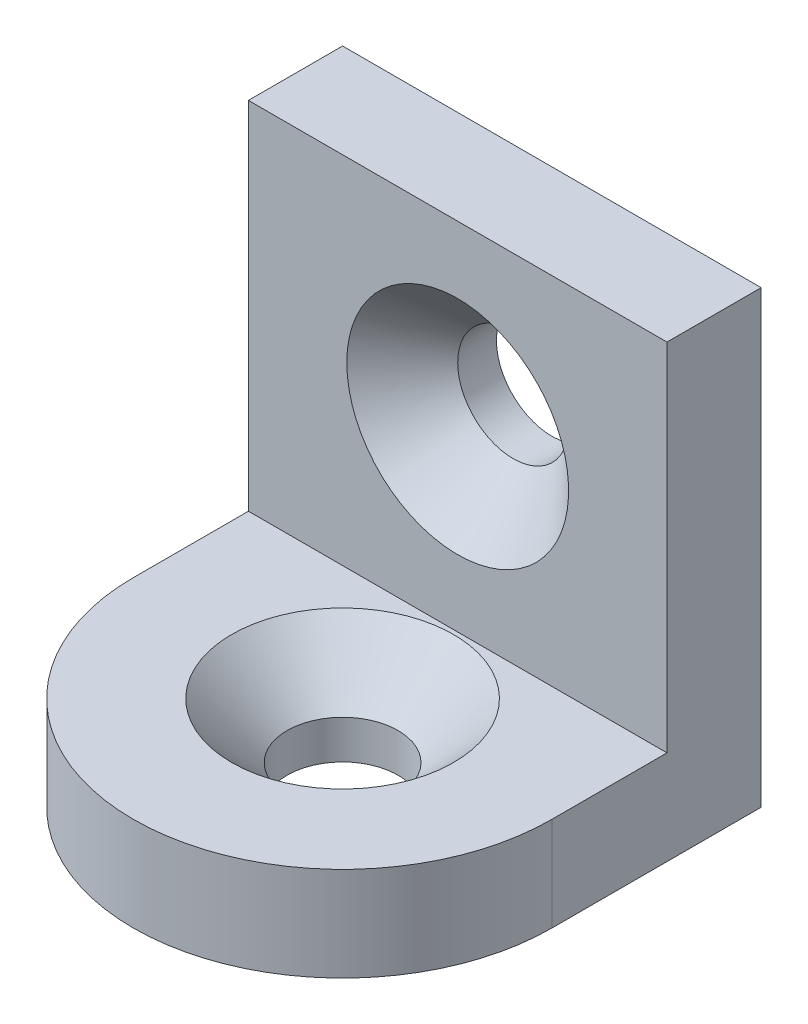
ISO-10303-21;
HEADER;
FILE_DESCRIPTION(('STEP AP214'),'2;1');
FILE_NAME('part.step','',(''),(''),'','','');
FILE_SCHEMA(('AUTOMOTIVE_DESIGN { 1 0 10303 214 1 1 1 1 }'));
ENDSEC;
DATA;
#1=APPLICATION_CONTEXT('core data for automotive mechanical design processes');
#2=APPLICATION_PROTOCOL_DEFINITION('international standard','automotive_design',2000,#1);
#3=PRODUCT_CONTEXT('',#1,'mechanical');
#4=PRODUCT('Part','Part','',(#3));
#5=PRODUCT_RELATED_PRODUCT_CATEGORY('part','',(#4));
#6=PRODUCT_DEFINITION_FORMATION('','',#4);
#7=PRODUCT_DEFINITION_CONTEXT('part definition',#1,'design');
#8=PRODUCT_DEFINITION('design','',#6,#7);
#9=PRODUCT_DEFINITION_SHAPE('','',#8);
#10=(LENGTH_UNIT() NAMED_UNIT(*) SI_UNIT(.MILLI.,.METRE.));
#11=(NAMED_UNIT(*) PLANE_ANGLE_UNIT() SI_UNIT($,.RADIAN.));
#12=(NAMED_UNIT(*) SI_UNIT($,.STERADIAN.) SOLID_ANGLE_UNIT());
#13=UNCERTAINTY_MEASURE_WITH_UNIT(LENGTH_MEASURE(1.E-05),#10,'distance_accuracy_value','');
#14=(GEOMETRIC_REPRESENTATION_CONTEXT(3) GLOBAL_UNCERTAINTY_ASSIGNED_CONTEXT((#13)) GLOBAL_UNIT_ASSIGNED_CONTEXT((#10,
#11,#12)) REPRESENTATION_CONTEXT('',''));
#15=CARTESIAN_POINT('',(0.,0.,0.));
#16=DIRECTION('',(0.,0.,1.));
#17=DIRECTION('',(1.,0.,0.));
#18=AXIS2_PLACEMENT_3D('',#15,#16,#17);
#19=CARTESIAN_POINT('',(-10.,4.5,0.));
#20=DIRECTION('',(1.,0.,0.));
#21=DIRECTION('',(0.,0.,-1.));
#22=AXIS2_PLACEMENT_3D('',#19,#20,#21);
#23=PLANE('',#22);
#24=DIRECTION('',(0.,0.,1.));
#25=VECTOR('',#24,1.);
#26=CARTESIAN_POINT('',(-10.,0.,0.));
#27=LINE('',#26,#25);
#28=CARTESIAN_POINT('',(-10.,0.,-10.));
#29=VERTEX_POINT('',#28);
#30=CARTESIAN_POINT('',(-10.,0.,0.));
#31=VERTEX_POINT('',#30);
#32=EDGE_CURVE('E86',#29,#31,#27,.T.);
#33=ORIENTED_EDGE('',*,*,#32,.T.);
#34=DIRECTION('',(0.,-1.,0.));
#35=VECTOR('',#34,1.);
#36=CARTESIAN_POINT('',(-10.,4.5,0.));
#37=LINE('',#36,#35);
#38=CARTESIAN_POINT('',(-10.,4.5,0.));
#39=VERTEX_POINT('',#38);
#40=EDGE_CURVE('E122',#39,#31,#37,.T.);
#41=ORIENTED_EDGE('',*,*,#40,.F.);
#42=DIRECTION('',(0.,0.,1.));
#43=VECTOR('',#42,1.);
#44=CARTESIAN_POINT('',(-10.,4.5,0.));
#45=LINE('',#44,#43);
#46=CARTESIAN_POINT('',(-10.,4.5,-5.5));
#47=VERTEX_POINT('',#46);
#48=EDGE_CURVE('E114',#47,#39,#45,.T.);
#49=ORIENTED_EDGE('',*,*,#48,.F.);
#50=DIRECTION('',(0.,-1.,0.));
#51=VECTOR('',#50,1.);
#52=CARTESIAN_POINT('',(-10.,21.5,-5.5));
#53=LINE('',#52,#51);
#54=CARTESIAN_POINT('',(-10.,21.5,-5.5));
#55=VERTEX_POINT('',#54);
#56=EDGE_CURVE('E105',#55,#47,#53,.T.);
#57=ORIENTED_EDGE('',*,*,#56,.F.);
#58=DIRECTION('',(0.,0.,1.));
#59=VECTOR('',#58,1.);
#60=CARTESIAN_POINT('',(-10.,21.5,-10.));
#61=LINE('',#60,#59);
#62=CARTESIAN_POINT('',(-10.,21.5,-10.));
#63=VERTEX_POINT('',#62);
#64=EDGE_CURVE('E89',#63,#55,#61,.T.);
#65=ORIENTED_EDGE('',*,*,#64,.F.);
#66=DIRECTION('',(0.,-1.,0.));
#67=VECTOR('',#66,1.);
#68=CARTESIAN_POINT('',(-10.,4.5,-10.));
#69=LINE('',#68,#67);
#70=EDGE_CURVE('E83',#63,#29,#69,.T.);
#71=ORIENTED_EDGE('',*,*,#70,.T.);
#72=EDGE_LOOP('',(#33,#41,#49,#57,#65,#71));
#73=FACE_BOUND('',#72,.T.);
#74=ADVANCED_FACE('F40',(#73),#23,.F.);
#75=CARTESIAN_POINT('',(0.,4.5,0.));
#76=DIRECTION('',(0.,-1.,0.));
#77=DIRECTION('',(0.,0.,-1.));
#78=AXIS2_PLACEMENT_3D('',#75,#76,#77);
#79=CYLINDRICAL_SURFACE('',#78,10.);
#80=CARTESIAN_POINT('',(0.,0.,0.));
#81=DIRECTION('',(0.,1.,0.));
#82=DIRECTION('',(0.,0.,1.));
#83=AXIS2_PLACEMENT_3D('',#80,#81,#82);
#84=CIRCLE('',#83,10.);
#85=CARTESIAN_POINT('',(10.,0.,0.));
#86=VERTEX_POINT('',#85);
#87=EDGE_CURVE('E103',#31,#86,#84,.T.);
#88=ORIENTED_EDGE('',*,*,#87,.T.);
#89=DIRECTION('',(0.,-1.,0.));
#90=VECTOR('',#89,1.);
#91=CARTESIAN_POINT('',(10.,4.5,0.));
#92=LINE('',#91,#90);
#93=CARTESIAN_POINT('',(10.,4.5,0.));
#94=VERTEX_POINT('',#93);
#95=EDGE_CURVE('E120',#94,#86,#92,.T.);
#96=ORIENTED_EDGE('',*,*,#95,.F.);
#97=CARTESIAN_POINT('',(0.,4.5,0.));
#98=DIRECTION('',(0.,1.,0.));
#99=DIRECTION('',(0.,0.,1.));
#100=AXIS2_PLACEMENT_3D('',#97,#98,#99);
#101=CIRCLE('',#100,10.);
#102=EDGE_CURVE('E206',#39,#94,#101,.T.);
#103=ORIENTED_EDGE('',*,*,#102,.F.);
#104=ORIENTED_EDGE('',*,*,#40,.T.);
#105=EDGE_LOOP('',(#88,#96,#103,#104));
#106=FACE_BOUND('',#105,.T.);
#107=ADVANCED_FACE('F145',(#106),#79,.T.);
#108=CARTESIAN_POINT('',(10.,4.5,0.));
#109=DIRECTION('',(1.,0.,0.));
#110=DIRECTION('',(0.,0.,-1.));
#111=AXIS2_PLACEMENT_3D('',#108,#109,#110);
#112=PLANE('',#111);
#113=DIRECTION('',(0.,0.,1.));
#114=VECTOR('',#113,1.);
#115=CARTESIAN_POINT('',(10.,0.,0.));
#116=LINE('',#115,#114);
#117=CARTESIAN_POINT('',(10.,0.,-10.));
#118=VERTEX_POINT('',#117);
#119=EDGE_CURVE('E111',#118,#86,#116,.T.);
#120=ORIENTED_EDGE('',*,*,#119,.F.);
#121=DIRECTION('',(0.,-1.,0.));
#122=VECTOR('',#121,1.);
#123=CARTESIAN_POINT('',(10.,4.5,-10.));
#124=LINE('',#123,#122);
#125=CARTESIAN_POINT('',(10.,21.5,-10.));
#126=VERTEX_POINT('',#125);
#127=EDGE_CURVE('E94',#126,#118,#124,.T.);
#128=ORIENTED_EDGE('',*,*,#127,.F.);
#129=DIRECTION('',(0.,0.,-1.));
#130=VECTOR('',#129,1.);
#131=CARTESIAN_POINT('',(10.,21.5,-10.));
#132=LINE('',#131,#130);
#133=CARTESIAN_POINT('',(10.,21.5,-5.5));
#134=VERTEX_POINT('',#133);
#135=EDGE_CURVE('E196',#134,#126,#132,.T.);
#136=ORIENTED_EDGE('',*,*,#135,.F.);
#137=DIRECTION('',(0.,-1.,0.));
#138=VECTOR('',#137,1.);
#139=CARTESIAN_POINT('',(10.,21.5,-5.5));
#140=LINE('',#139,#138);
#141=CARTESIAN_POINT('',(10.,4.5,-5.5));
#142=VERTEX_POINT('',#141);
#143=EDGE_CURVE('E200',#134,#142,#140,.T.);
#144=ORIENTED_EDGE('',*,*,#143,.T.);
#145=DIRECTION('',(0.,0.,1.));
#146=VECTOR('',#145,1.);
#147=CARTESIAN_POINT('',(10.,4.5,0.));
#148=LINE('',#147,#146);
#149=EDGE_CURVE('E64',#142,#94,#148,.T.);
#150=ORIENTED_EDGE('',*,*,#149,.T.);
#151=ORIENTED_EDGE('',*,*,#95,.T.);
#152=EDGE_LOOP('',(#120,#128,#136,#144,#150,#151));
#153=FACE_BOUND('',#152,.T.);
#154=ADVANCED_FACE('F150',(#153),#112,.T.);
#155=CARTESIAN_POINT('',(0.,4.5,-10.));
#156=DIRECTION('',(0.,0.,-1.));
#157=DIRECTION('',(-1.,0.,0.));
#158=AXIS2_PLACEMENT_3D('',#155,#156,#157);
#159=PLANE('',#158);
#160=CARTESIAN_POINT('',(0.,13.,-10.));
#161=DIRECTION('',(0.,0.,-1.));
#162=DIRECTION('',(-1.,0.,0.));
#163=AXIS2_PLACEMENT_3D('',#160,#161,#162);
#164=CIRCLE('',#163,2.65);
#165=CARTESIAN_POINT('',(-2.65,13.,-10.));
#166=VERTEX_POINT('',#165);
#167=EDGE_CURVE('E188',#166,#166,#164,.T.);
#168=ORIENTED_EDGE('',*,*,#167,.F.);
#169=EDGE_LOOP('',(#168));
#170=FACE_BOUND('',#169,.T.);
#171=DIRECTION('',(1.,0.,0.));
#172=VECTOR('',#171,1.);
#173=CARTESIAN_POINT('',(0.,0.,-10.));
#174=LINE('',#173,#172);
#175=EDGE_CURVE('E101',#29,#118,#174,.T.);
#176=ORIENTED_EDGE('',*,*,#175,.F.);
#177=ORIENTED_EDGE('',*,*,#70,.F.);
#178=DIRECTION('',(-1.,0.,0.));
#179=VECTOR('',#178,1.);
#180=CARTESIAN_POINT('',(-10.,21.5,-10.));
#181=LINE('',#180,#179);
#182=EDGE_CURVE('E199',#126,#63,#181,.T.);
#183=ORIENTED_EDGE('',*,*,#182,.F.);
#184=ORIENTED_EDGE('',*,*,#127,.T.);
#185=EDGE_LOOP('',(#176,#177,#183,#184));
#186=FACE_BOUND('',#185,.T.);
#187=ADVANCED_FACE('F107',(#170,#186),#159,.T.);
#188=CARTESIAN_POINT('',(0.,4.5,0.));
#189=DIRECTION('',(0.,-1.,0.));
#190=DIRECTION('',(0.,0.,-1.));
#191=AXIS2_PLACEMENT_3D('',#188,#189,#190);
#192=CYLINDRICAL_SURFACE('',#191,2.65);
#193=CARTESIAN_POINT('',(0.,1.85,0.));
#194=DIRECTION('',(0.,1.,0.));
#195=DIRECTION('',(0.,0.,1.));
#196=AXIS2_PLACEMENT_3D('',#193,#194,#195);
#197=CIRCLE('',#196,2.65);
#198=CARTESIAN_POINT('',(0.,1.85,2.65));
#199=VERTEX_POINT('',#198);
#200=EDGE_CURVE('E49',#199,#199,#197,.T.);
#201=ORIENTED_EDGE('',*,*,#200,.T.);
#202=EDGE_LOOP('',(#201));
#203=FACE_BOUND('',#202,.T.);
#204=CARTESIAN_POINT('',(0.,0.,0.));
#205=DIRECTION('',(0.,1.,0.));
#206=DIRECTION('',(0.,0.,1.));
#207=AXIS2_PLACEMENT_3D('',#204,#205,#206);
#208=CIRCLE('',#207,2.65);
#209=CARTESIAN_POINT('',(0.,0.,2.65));
#210=VERTEX_POINT('',#209);
#211=EDGE_CURVE('E110',#210,#210,#208,.T.);
#212=ORIENTED_EDGE('',*,*,#211,.F.);
#213=EDGE_LOOP('',(#212));
#214=FACE_BOUND('',#213,.T.);
#215=ADVANCED_FACE('F132',(#203,#214),#192,.F.);
#216=CARTESIAN_POINT('',(0.,4.5,0.));
#217=DIRECTION('',(0.,1.,0.));
#218=DIRECTION('',(0.,0.,1.));
#219=AXIS2_PLACEMENT_3D('',#216,#217,#218);
#220=PLANE('',#219);
#221=CARTESIAN_POINT('',(0.,4.5,0.));
#222=DIRECTION('',(0.,1.,0.));
#223=DIRECTION('',(0.,0.,1.));
#224=AXIS2_PLACEMENT_3D('',#221,#222,#223);
#225=CIRCLE('',#224,5.30000000000001);
#226=CARTESIAN_POINT('',(0.,4.5,5.30000000000001));
#227=VERTEX_POINT('',#226);
#228=EDGE_CURVE('E11',#227,#227,#225,.F.);
#229=ORIENTED_EDGE('',*,*,#228,.T.);
#230=EDGE_LOOP('',(#229));
#231=FACE_BOUND('',#230,.T.);
#232=DIRECTION('',(1.,0.,0.));
#233=VECTOR('',#232,1.);
#234=CARTESIAN_POINT('',(-10.,4.5,-5.5));
#235=LINE('',#234,#233);
#236=EDGE_CURVE('E56',#47,#142,#235,.T.);
#237=ORIENTED_EDGE('',*,*,#236,.F.);
#238=ORIENTED_EDGE('',*,*,#48,.T.);
#239=ORIENTED_EDGE('',*,*,#102,.T.);
#240=ORIENTED_EDGE('',*,*,#149,.F.);
#241=EDGE_LOOP('',(#237,#238,#239,#240));
#242=FACE_BOUND('',#241,.T.);
#243=ADVANCED_FACE('F166',(#231,#242),#220,.T.);
#244=CARTESIAN_POINT('',(0.,0.,0.));
#245=DIRECTION('',(0.,1.,0.));
#246=DIRECTION('',(0.,0.,1.));
#247=AXIS2_PLACEMENT_3D('',#244,#245,#246);
#248=PLANE('',#247);
#249=ORIENTED_EDGE('',*,*,#32,.F.);
#250=ORIENTED_EDGE('',*,*,#175,.T.);
#251=ORIENTED_EDGE('',*,*,#119,.T.);
#252=ORIENTED_EDGE('',*,*,#87,.F.);
#253=EDGE_LOOP('',(#249,#250,#251,#252));
#254=FACE_BOUND('',#253,.T.);
#255=ORIENTED_EDGE('',*,*,#211,.T.);
#256=EDGE_LOOP('',(#255));
#257=FACE_BOUND('',#256,.T.);
#258=ADVANCED_FACE('F98',(#254,#257),#248,.F.);
#259=CARTESIAN_POINT('',(-10.,21.5,-5.5));
#260=DIRECTION('',(0.,0.,-1.));
#261=DIRECTION('',(-1.,0.,0.));
#262=AXIS2_PLACEMENT_3D('',#259,#260,#261);
#263=PLANE('',#262);
#264=CARTESIAN_POINT('',(0.,13.,-5.5));
#265=DIRECTION('',(0.,0.,-1.));
#266=DIRECTION('',(-1.,0.,0.));
#267=AXIS2_PLACEMENT_3D('',#264,#265,#266);
#268=CIRCLE('',#267,5.3);
#269=CARTESIAN_POINT('',(-5.3,13.,-5.5));
#270=VERTEX_POINT('',#269);
#271=EDGE_CURVE('E127',#270,#270,#268,.T.);
#272=ORIENTED_EDGE('',*,*,#271,.T.);
#273=EDGE_LOOP('',(#272));
#274=FACE_BOUND('',#273,.T.);
#275=ORIENTED_EDGE('',*,*,#236,.T.);
#276=ORIENTED_EDGE('',*,*,#143,.F.);
#277=DIRECTION('',(1.,0.,0.));
#278=VECTOR('',#277,1.);
#279=CARTESIAN_POINT('',(-10.,21.5,-5.5));
#280=LINE('',#279,#278);
#281=EDGE_CURVE('E193',#55,#134,#280,.T.);
#282=ORIENTED_EDGE('',*,*,#281,.F.);
#283=ORIENTED_EDGE('',*,*,#56,.T.);
#284=EDGE_LOOP('',(#275,#276,#282,#283));
#285=FACE_BOUND('',#284,.T.);
#286=ADVANCED_FACE('F169',(#274,#285),#263,.F.);
#287=CARTESIAN_POINT('',(0.,21.5,0.));
#288=DIRECTION('',(0.,1.,0.));
#289=DIRECTION('',(0.,0.,1.));
#290=AXIS2_PLACEMENT_3D('',#287,#288,#289);
#291=PLANE('',#290);
#292=ORIENTED_EDGE('',*,*,#64,.T.);
#293=ORIENTED_EDGE('',*,*,#281,.T.);
#294=ORIENTED_EDGE('',*,*,#135,.T.);
#295=ORIENTED_EDGE('',*,*,#182,.T.);
#296=EDGE_LOOP('',(#292,#293,#294,#295));
#297=FACE_BOUND('',#296,.T.);
#298=ADVANCED_FACE('F175',(#297),#291,.T.);
#299=CARTESIAN_POINT('',(0.,13.,-22.5));
#300=DIRECTION('',(0.,0.,1.));
#301=DIRECTION('',(1.,0.,0.));
#302=AXIS2_PLACEMENT_3D('',#299,#300,#301);
#303=CYLINDRICAL_SURFACE('',#302,2.65);
#304=CARTESIAN_POINT('',(0.,13.,-8.14999999999999));
#305=DIRECTION('',(0.,0.,-1.));
#306=DIRECTION('',(-1.,0.,0.));
#307=AXIS2_PLACEMENT_3D('',#304,#305,#306);
#308=CIRCLE('',#307,2.65);
#309=CARTESIAN_POINT('',(-2.65,13.,-8.14999999999999));
#310=VERTEX_POINT('',#309);
#311=EDGE_CURVE('E124',#310,#310,#308,.F.);
#312=ORIENTED_EDGE('',*,*,#311,.T.);
#313=EDGE_LOOP('',(#312));
#314=FACE_BOUND('',#313,.T.);
#315=ORIENTED_EDGE('',*,*,#167,.T.);
#316=EDGE_LOOP('',(#315));
#317=FACE_BOUND('',#316,.T.);
#318=ADVANCED_FACE('F141',(#314,#317),#303,.F.);
#319=CARTESIAN_POINT('',(0.,13.,-8.14999999999999));
#320=DIRECTION('',(0.,0.,1.));
#321=DIRECTION('',(1.,0.,0.));
#322=AXIS2_PLACEMENT_3D('',#319,#320,#321);
#323=CONICAL_SURFACE('',#322,2.65,0.78539816339745);
#324=ORIENTED_EDGE('',*,*,#271,.F.);
#325=EDGE_LOOP('',(#324));
#326=FACE_BOUND('',#325,.T.);
#327=ORIENTED_EDGE('',*,*,#311,.F.);
#328=EDGE_LOOP('',(#327));
#329=FACE_BOUND('',#328,.T.);
#330=ADVANCED_FACE('F136',(#326,#329),#323,.F.);
#331=CARTESIAN_POINT('',(0.,1.85,0.));
#332=DIRECTION('',(0.,1.,0.));
#333=DIRECTION('',(0.,0.,1.));
#334=AXIS2_PLACEMENT_3D('',#331,#332,#333);
#335=CONICAL_SURFACE('',#334,2.65,0.78539816339745);
#336=ORIENTED_EDGE('',*,*,#228,.F.);
#337=EDGE_LOOP('',(#336));
#338=FACE_BOUND('',#337,.T.);
#339=ORIENTED_EDGE('',*,*,#200,.F.);
#340=EDGE_LOOP('',(#339));
#341=FACE_BOUND('',#340,.T.);
#342=ADVANCED_FACE('F43',(#338,#341),#335,.F.);
#343=CLOSED_SHELL('',(#74,#107,#154,#187,#215,#243,#258,#286,#298,#318,#330,#342));
#344=MANIFOLD_SOLID_BREP('B2',#343);
#345=ADVANCED_BREP_SHAPE_REPRESENTATION('',(#18,#344),#14);
#346=SHAPE_DEFINITION_REPRESENTATION(#9,#345);
ENDSEC;
END-ISO-10303-21;
